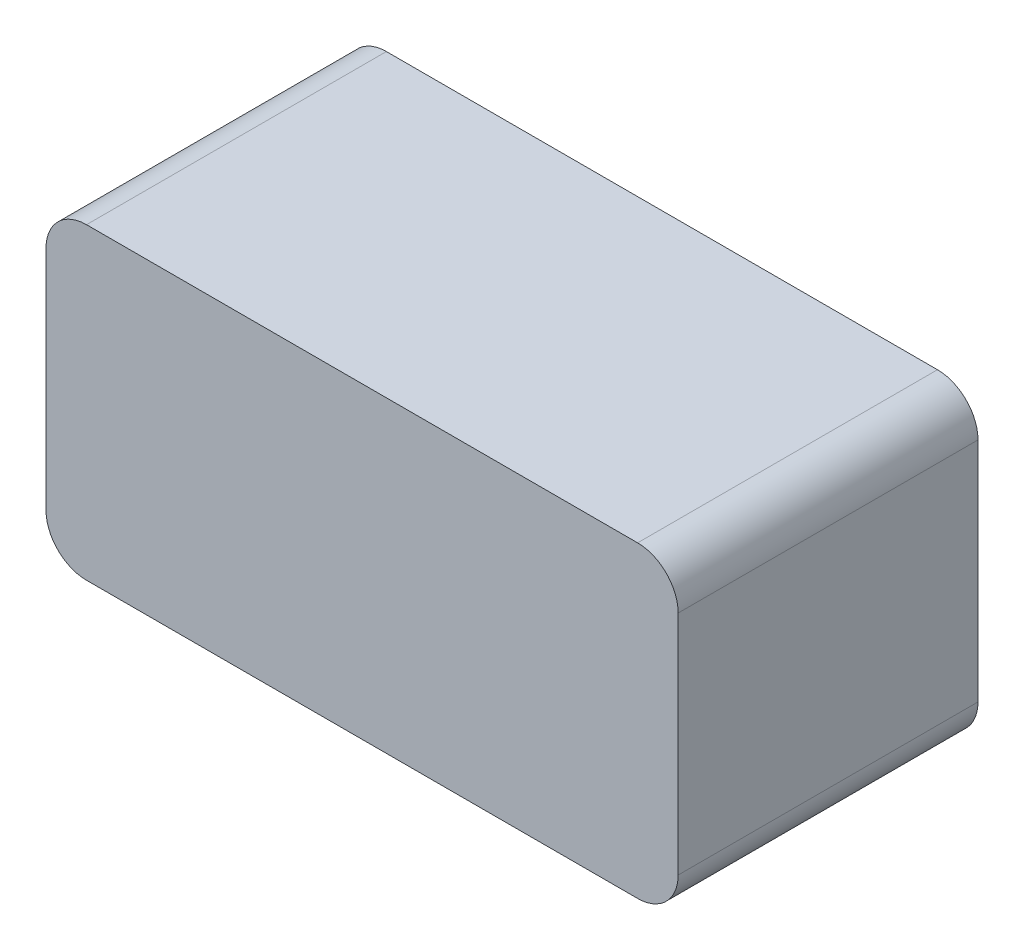
ISO-10303-21;
HEADER;
FILE_DESCRIPTION(('STEP AP214'),'2;1');
FILE_NAME('part.step','',(''),(''),'','','');
FILE_SCHEMA(('AUTOMOTIVE_DESIGN { 1 0 10303 214 1 1 1 1 }'));
ENDSEC;
DATA;
#1=APPLICATION_CONTEXT('core data for automotive mechanical design processes');
#2=APPLICATION_PROTOCOL_DEFINITION('international standard','automotive_design',2000,#1);
#3=PRODUCT_CONTEXT('',#1,'mechanical');
#4=PRODUCT('Part','Part','',(#3));
#5=PRODUCT_RELATED_PRODUCT_CATEGORY('part','',(#4));
#6=PRODUCT_DEFINITION_FORMATION('','',#4);
#7=PRODUCT_DEFINITION_CONTEXT('part definition',#1,'design');
#8=PRODUCT_DEFINITION('design','',#6,#7);
#9=PRODUCT_DEFINITION_SHAPE('','',#8);
#10=(LENGTH_UNIT() NAMED_UNIT(*) SI_UNIT(.MILLI.,.METRE.));
#11=(NAMED_UNIT(*) PLANE_ANGLE_UNIT() SI_UNIT($,.RADIAN.));
#12=(NAMED_UNIT(*) SI_UNIT($,.STERADIAN.) SOLID_ANGLE_UNIT());
#13=UNCERTAINTY_MEASURE_WITH_UNIT(LENGTH_MEASURE(1.E-05),#10,'distance_accuracy_value','');
#14=(GEOMETRIC_REPRESENTATION_CONTEXT(3) GLOBAL_UNCERTAINTY_ASSIGNED_CONTEXT((#13)) GLOBAL_UNIT_ASSIGNED_CONTEXT((#10,
#11,#12)) REPRESENTATION_CONTEXT('',''));
#15=CARTESIAN_POINT('',(0.,0.,0.));
#16=DIRECTION('',(0.,0.,1.));
#17=DIRECTION('',(1.,0.,0.));
#18=AXIS2_PLACEMENT_3D('',#15,#16,#17);
#19=CARTESIAN_POINT('',(0.,38.,0.));
#20=DIRECTION('',(1.,0.,0.));
#21=DIRECTION('',(0.,0.,-1.));
#22=AXIS2_PLACEMENT_3D('',#19,#20,#21);
#23=PLANE('',#22);
#24=DIRECTION('',(0.,-1.,0.));
#25=VECTOR('',#24,1.);
#26=CARTESIAN_POINT('',(0.,38.,-37.));
#27=LINE('',#26,#25);
#28=CARTESIAN_POINT('',(0.,33.,-37.));
#29=VERTEX_POINT('',#28);
#30=CARTESIAN_POINT('',(0.,5.,-37.));
#31=VERTEX_POINT('',#30);
#32=EDGE_CURVE('E132',#29,#31,#27,.T.);
#33=ORIENTED_EDGE('',*,*,#32,.T.);
#34=DIRECTION('',(0.,0.,1.));
#35=VECTOR('',#34,1.);
#36=CARTESIAN_POINT('',(0.,5.,0.));
#37=LINE('',#36,#35);
#38=CARTESIAN_POINT('',(0.,5.,0.));
#39=VERTEX_POINT('',#38);
#40=EDGE_CURVE('E11',#31,#39,#37,.T.);
#41=ORIENTED_EDGE('',*,*,#40,.T.);
#42=DIRECTION('',(0.,-1.,0.));
#43=VECTOR('',#42,1.);
#44=CARTESIAN_POINT('',(0.,38.,0.));
#45=LINE('',#44,#43);
#46=CARTESIAN_POINT('',(0.,33.,0.));
#47=VERTEX_POINT('',#46);
#48=EDGE_CURVE('E138',#47,#39,#45,.T.);
#49=ORIENTED_EDGE('',*,*,#48,.F.);
#50=DIRECTION('',(0.,0.,1.));
#51=VECTOR('',#50,1.);
#52=CARTESIAN_POINT('',(0.,33.,0.));
#53=LINE('',#52,#51);
#54=EDGE_CURVE('E50',#47,#29,#53,.F.);
#55=ORIENTED_EDGE('',*,*,#54,.T.);
#56=EDGE_LOOP('',(#33,#41,#49,#55));
#57=FACE_BOUND('',#56,.T.);
#58=ADVANCED_FACE('F41',(#57),#23,.F.);
#59=CARTESIAN_POINT('',(0.,38.,0.));
#60=DIRECTION('',(0.,0.,-1.));
#61=DIRECTION('',(-1.,0.,0.));
#62=AXIS2_PLACEMENT_3D('',#59,#60,#61);
#63=PLANE('',#62);
#64=DIRECTION('',(1.,0.,0.));
#65=VECTOR('',#64,1.);
#66=CARTESIAN_POINT('',(0.,0.,0.));
#67=LINE('',#66,#65);
#68=CARTESIAN_POINT('',(5.,0.,0.));
#69=VERTEX_POINT('',#68);
#70=CARTESIAN_POINT('',(73.,0.,0.));
#71=VERTEX_POINT('',#70);
#72=EDGE_CURVE('E198',#69,#71,#67,.T.);
#73=ORIENTED_EDGE('',*,*,#72,.T.);
#74=CARTESIAN_POINT('',(73.,5.,0.));
#75=DIRECTION('',(0.,0.,-1.));
#76=DIRECTION('',(-1.,0.,0.));
#77=AXIS2_PLACEMENT_3D('',#74,#75,#76);
#78=CIRCLE('',#77,5.);
#79=CARTESIAN_POINT('',(78.,5.,0.));
#80=VERTEX_POINT('',#79);
#81=EDGE_CURVE('E165',#71,#80,#78,.F.);
#82=ORIENTED_EDGE('',*,*,#81,.T.);
#83=DIRECTION('',(0.,-1.,0.));
#84=VECTOR('',#83,1.);
#85=CARTESIAN_POINT('',(78.,38.,0.));
#86=LINE('',#85,#84);
#87=CARTESIAN_POINT('',(78.,33.,0.));
#88=VERTEX_POINT('',#87);
#89=EDGE_CURVE('E131',#88,#80,#86,.T.);
#90=ORIENTED_EDGE('',*,*,#89,.F.);
#91=CARTESIAN_POINT('',(73.,33.,0.));
#92=DIRECTION('',(0.,0.,-1.));
#93=DIRECTION('',(-1.,0.,0.));
#94=AXIS2_PLACEMENT_3D('',#91,#92,#93);
#95=CIRCLE('',#94,5.);
#96=CARTESIAN_POINT('',(73.,38.,0.));
#97=VERTEX_POINT('',#96);
#98=EDGE_CURVE('E136',#88,#97,#95,.F.);
#99=ORIENTED_EDGE('',*,*,#98,.T.);
#100=DIRECTION('',(1.,0.,0.));
#101=VECTOR('',#100,1.);
#102=CARTESIAN_POINT('',(0.,38.,0.));
#103=LINE('',#102,#101);
#104=CARTESIAN_POINT('',(5.,38.,0.));
#105=VERTEX_POINT('',#104);
#106=EDGE_CURVE('E189',#105,#97,#103,.T.);
#107=ORIENTED_EDGE('',*,*,#106,.F.);
#108=CARTESIAN_POINT('',(5.,33.,0.));
#109=DIRECTION('',(0.,0.,-1.));
#110=DIRECTION('',(-1.,0.,0.));
#111=AXIS2_PLACEMENT_3D('',#108,#109,#110);
#112=CIRCLE('',#111,5.);
#113=EDGE_CURVE('E64',#105,#47,#112,.F.);
#114=ORIENTED_EDGE('',*,*,#113,.T.);
#115=ORIENTED_EDGE('',*,*,#48,.T.);
#116=CARTESIAN_POINT('',(5.,5.,0.));
#117=DIRECTION('',(0.,0.,-1.));
#118=DIRECTION('',(-1.,0.,0.));
#119=AXIS2_PLACEMENT_3D('',#116,#117,#118);
#120=CIRCLE('',#119,5.);
#121=EDGE_CURVE('E57',#39,#69,#120,.F.);
#122=ORIENTED_EDGE('',*,*,#121,.T.);
#123=EDGE_LOOP('',(#73,#82,#90,#99,#107,#114,#115,#122));
#124=FACE_BOUND('',#123,.T.);
#125=ADVANCED_FACE('F191',(#124),#63,.F.);
#126=CARTESIAN_POINT('',(78.,38.,0.));
#127=DIRECTION('',(-1.,0.,0.));
#128=DIRECTION('',(0.,0.,1.));
#129=AXIS2_PLACEMENT_3D('',#126,#127,#128);
#130=PLANE('',#129);
#131=ORIENTED_EDGE('',*,*,#89,.T.);
#132=DIRECTION('',(0.,0.,-1.));
#133=VECTOR('',#132,1.);
#134=CARTESIAN_POINT('',(78.,5.,-37.));
#135=LINE('',#134,#133);
#136=CARTESIAN_POINT('',(78.,5.,-37.));
#137=VERTEX_POINT('',#136);
#138=EDGE_CURVE('E129',#80,#137,#135,.T.);
#139=ORIENTED_EDGE('',*,*,#138,.T.);
#140=DIRECTION('',(0.,-1.,0.));
#141=VECTOR('',#140,1.);
#142=CARTESIAN_POINT('',(78.,38.,-37.));
#143=LINE('',#142,#141);
#144=CARTESIAN_POINT('',(78.,33.,-37.));
#145=VERTEX_POINT('',#144);
#146=EDGE_CURVE('E111',#145,#137,#143,.T.);
#147=ORIENTED_EDGE('',*,*,#146,.F.);
#148=DIRECTION('',(0.,0.,-1.));
#149=VECTOR('',#148,1.);
#150=CARTESIAN_POINT('',(78.,33.,0.));
#151=LINE('',#150,#149);
#152=EDGE_CURVE('E126',#145,#88,#151,.F.);
#153=ORIENTED_EDGE('',*,*,#152,.T.);
#154=EDGE_LOOP('',(#131,#139,#147,#153));
#155=FACE_BOUND('',#154,.T.);
#156=ADVANCED_FACE('F125',(#155),#130,.F.);
#157=CARTESIAN_POINT('',(0.,38.,-37.));
#158=DIRECTION('',(0.,0.,1.));
#159=DIRECTION('',(1.,0.,0.));
#160=AXIS2_PLACEMENT_3D('',#157,#158,#159);
#161=PLANE('',#160);
#162=ORIENTED_EDGE('',*,*,#146,.T.);
#163=CARTESIAN_POINT('',(73.,5.,-37.));
#164=DIRECTION('',(0.,0.,1.));
#165=DIRECTION('',(1.,0.,0.));
#166=AXIS2_PLACEMENT_3D('',#163,#164,#165);
#167=CIRCLE('',#166,5.);
#168=CARTESIAN_POINT('',(73.,0.,-37.));
#169=VERTEX_POINT('',#168);
#170=EDGE_CURVE('E119',#137,#169,#167,.F.);
#171=ORIENTED_EDGE('',*,*,#170,.T.);
#172=DIRECTION('',(-1.,0.,0.));
#173=VECTOR('',#172,1.);
#174=CARTESIAN_POINT('',(0.,0.,-37.));
#175=LINE('',#174,#173);
#176=CARTESIAN_POINT('',(5.,0.,-37.));
#177=VERTEX_POINT('',#176);
#178=EDGE_CURVE('E193',#169,#177,#175,.T.);
#179=ORIENTED_EDGE('',*,*,#178,.T.);
#180=CARTESIAN_POINT('',(5.,5.,-37.));
#181=DIRECTION('',(0.,0.,1.));
#182=DIRECTION('',(1.,0.,0.));
#183=AXIS2_PLACEMENT_3D('',#180,#181,#182);
#184=CIRCLE('',#183,5.);
#185=EDGE_CURVE('E120',#177,#31,#184,.F.);
#186=ORIENTED_EDGE('',*,*,#185,.T.);
#187=ORIENTED_EDGE('',*,*,#32,.F.);
#188=CARTESIAN_POINT('',(5.,33.,-37.));
#189=DIRECTION('',(0.,0.,1.));
#190=DIRECTION('',(1.,0.,0.));
#191=AXIS2_PLACEMENT_3D('',#188,#189,#190);
#192=CIRCLE('',#191,5.);
#193=CARTESIAN_POINT('',(5.,38.,-37.));
#194=VERTEX_POINT('',#193);
#195=EDGE_CURVE('E142',#29,#194,#192,.F.);
#196=ORIENTED_EDGE('',*,*,#195,.T.);
#197=DIRECTION('',(-1.,0.,0.));
#198=VECTOR('',#197,1.);
#199=CARTESIAN_POINT('',(0.,38.,-37.));
#200=LINE('',#199,#198);
#201=CARTESIAN_POINT('',(73.,38.,-37.));
#202=VERTEX_POINT('',#201);
#203=EDGE_CURVE('E113',#202,#194,#200,.T.);
#204=ORIENTED_EDGE('',*,*,#203,.F.);
#205=CARTESIAN_POINT('',(73.,33.,-37.));
#206=DIRECTION('',(0.,0.,1.));
#207=DIRECTION('',(1.,0.,0.));
#208=AXIS2_PLACEMENT_3D('',#205,#206,#207);
#209=CIRCLE('',#208,5.);
#210=EDGE_CURVE('E108',#202,#145,#209,.F.);
#211=ORIENTED_EDGE('',*,*,#210,.T.);
#212=EDGE_LOOP('',(#162,#171,#179,#186,#187,#196,#204,#211));
#213=FACE_BOUND('',#212,.T.);
#214=ADVANCED_FACE('F110',(#213),#161,.F.);
#215=CARTESIAN_POINT('',(0.,38.,0.));
#216=DIRECTION('',(0.,-1.,0.));
#217=DIRECTION('',(0.,0.,-1.));
#218=AXIS2_PLACEMENT_3D('',#215,#216,#217);
#219=PLANE('',#218);
#220=ORIENTED_EDGE('',*,*,#106,.T.);
#221=DIRECTION('',(0.,0.,-1.));
#222=VECTOR('',#221,1.);
#223=CARTESIAN_POINT('',(73.,38.,0.));
#224=LINE('',#223,#222);
#225=EDGE_CURVE('E172',#97,#202,#224,.T.);
#226=ORIENTED_EDGE('',*,*,#225,.T.);
#227=ORIENTED_EDGE('',*,*,#203,.T.);
#228=DIRECTION('',(0.,0.,1.));
#229=VECTOR('',#228,1.);
#230=CARTESIAN_POINT('',(5.,38.,0.));
#231=LINE('',#230,#229);
#232=EDGE_CURVE('E168',#194,#105,#231,.T.);
#233=ORIENTED_EDGE('',*,*,#232,.T.);
#234=EDGE_LOOP('',(#220,#226,#227,#233));
#235=FACE_BOUND('',#234,.T.);
#236=ADVANCED_FACE('F188',(#235),#219,.F.);
#237=CARTESIAN_POINT('',(0.,0.,0.));
#238=DIRECTION('',(0.,-1.,0.));
#239=DIRECTION('',(0.,0.,-1.));
#240=AXIS2_PLACEMENT_3D('',#237,#238,#239);
#241=PLANE('',#240);
#242=ORIENTED_EDGE('',*,*,#178,.F.);
#243=DIRECTION('',(0.,0.,-1.));
#244=VECTOR('',#243,1.);
#245=CARTESIAN_POINT('',(73.,0.,0.));
#246=LINE('',#245,#244);
#247=EDGE_CURVE('E156',#169,#71,#246,.F.);
#248=ORIENTED_EDGE('',*,*,#247,.T.);
#249=ORIENTED_EDGE('',*,*,#72,.F.);
#250=DIRECTION('',(0.,0.,1.));
#251=VECTOR('',#250,1.);
#252=CARTESIAN_POINT('',(5.,0.,-37.));
#253=LINE('',#252,#251);
#254=EDGE_CURVE('E153',#69,#177,#253,.F.);
#255=ORIENTED_EDGE('',*,*,#254,.T.);
#256=EDGE_LOOP('',(#242,#248,#249,#255));
#257=FACE_BOUND('',#256,.T.);
#258=ADVANCED_FACE('F209',(#257),#241,.T.);
#259=CARTESIAN_POINT('',(73.,5.,0.));
#260=DIRECTION('',(0.,0.,1.));
#261=DIRECTION('',(1.,0.,0.));
#262=AXIS2_PLACEMENT_3D('',#259,#260,#261);
#263=CYLINDRICAL_SURFACE('',#262,5.);
#264=ORIENTED_EDGE('',*,*,#81,.F.);
#265=ORIENTED_EDGE('',*,*,#247,.F.);
#266=ORIENTED_EDGE('',*,*,#170,.F.);
#267=ORIENTED_EDGE('',*,*,#138,.F.);
#268=EDGE_LOOP('',(#264,#265,#266,#267));
#269=FACE_BOUND('',#268,.T.);
#270=ADVANCED_FACE('F205',(#269),#263,.T.);
#271=CARTESIAN_POINT('',(73.,33.,0.));
#272=DIRECTION('',(0.,0.,-1.));
#273=DIRECTION('',(-1.,0.,0.));
#274=AXIS2_PLACEMENT_3D('',#271,#272,#273);
#275=CYLINDRICAL_SURFACE('',#274,5.);
#276=ORIENTED_EDGE('',*,*,#98,.F.);
#277=ORIENTED_EDGE('',*,*,#152,.F.);
#278=ORIENTED_EDGE('',*,*,#210,.F.);
#279=ORIENTED_EDGE('',*,*,#225,.F.);
#280=EDGE_LOOP('',(#276,#277,#278,#279));
#281=FACE_BOUND('',#280,.T.);
#282=ADVANCED_FACE('F135',(#281),#275,.T.);
#283=CARTESIAN_POINT('',(5.,5.,0.));
#284=DIRECTION('',(0.,0.,-1.));
#285=DIRECTION('',(-1.,0.,0.));
#286=AXIS2_PLACEMENT_3D('',#283,#284,#285);
#287=CYLINDRICAL_SURFACE('',#286,5.);
#288=ORIENTED_EDGE('',*,*,#185,.F.);
#289=ORIENTED_EDGE('',*,*,#254,.F.);
#290=ORIENTED_EDGE('',*,*,#121,.F.);
#291=ORIENTED_EDGE('',*,*,#40,.F.);
#292=EDGE_LOOP('',(#288,#289,#290,#291));
#293=FACE_BOUND('',#292,.T.);
#294=ADVANCED_FACE('F211',(#293),#287,.T.);
#295=CARTESIAN_POINT('',(5.,33.,0.));
#296=DIRECTION('',(0.,0.,1.));
#297=DIRECTION('',(1.,0.,0.));
#298=AXIS2_PLACEMENT_3D('',#295,#296,#297);
#299=CYLINDRICAL_SURFACE('',#298,5.);
#300=ORIENTED_EDGE('',*,*,#195,.F.);
#301=ORIENTED_EDGE('',*,*,#54,.F.);
#302=ORIENTED_EDGE('',*,*,#113,.F.);
#303=ORIENTED_EDGE('',*,*,#232,.F.);
#304=EDGE_LOOP('',(#300,#301,#302,#303));
#305=FACE_BOUND('',#304,.T.);
#306=ADVANCED_FACE('F43',(#305),#299,.T.);
#307=CLOSED_SHELL('',(#58,#125,#156,#214,#236,#258,#270,#282,#294,#306));
#308=MANIFOLD_SOLID_BREP('B2',#307);
#309=ADVANCED_BREP_SHAPE_REPRESENTATION('',(#18,#308),#14);
#310=SHAPE_DEFINITION_REPRESENTATION(#9,#309);
ENDSEC;
END-ISO-10303-21;
